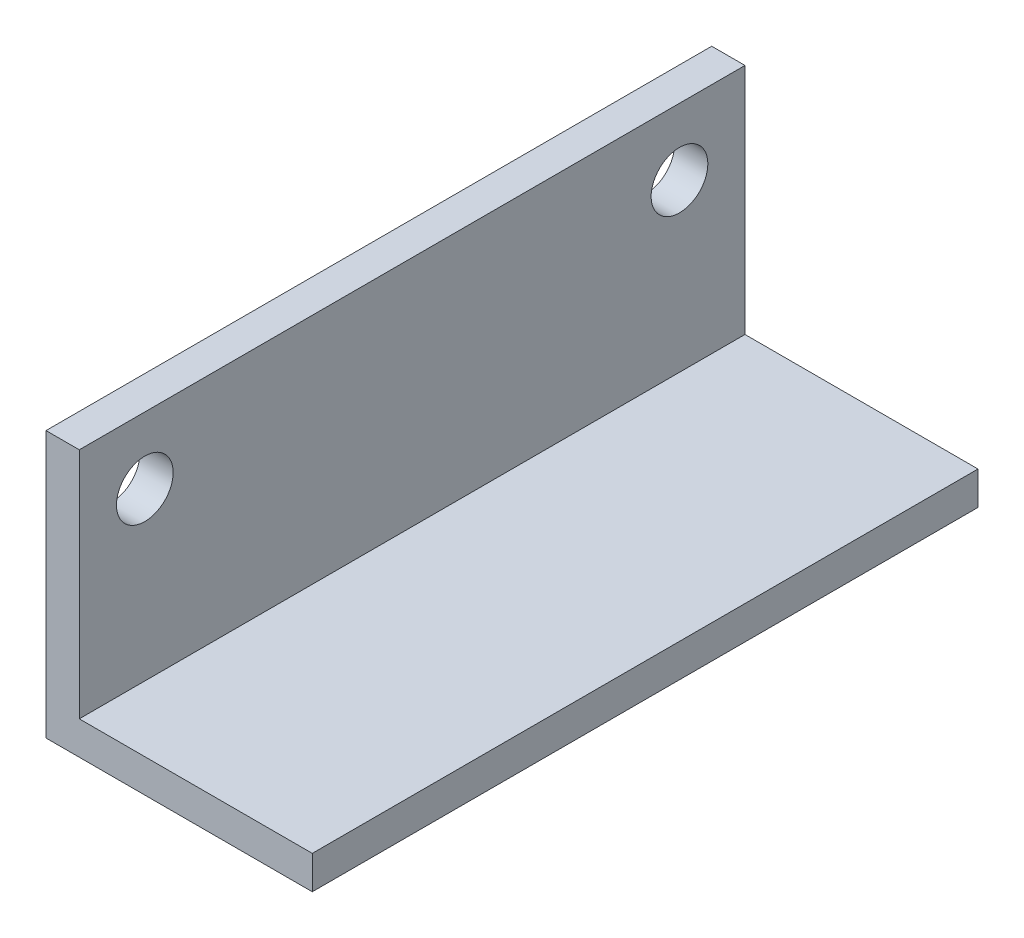
ISO-10303-21;
HEADER;
FILE_DESCRIPTION(('STEP AP214'),'2;1');
FILE_NAME('part.step','',(''),(''),'','','');
FILE_SCHEMA(('AUTOMOTIVE_DESIGN { 1 0 10303 214 1 1 1 1 }'));
ENDSEC;
DATA;
#1=APPLICATION_CONTEXT('core data for automotive mechanical design processes');
#2=APPLICATION_PROTOCOL_DEFINITION('international standard','automotive_design',2000,#1);
#3=PRODUCT_CONTEXT('',#1,'mechanical');
#4=PRODUCT('Part','Part','',(#3));
#5=PRODUCT_RELATED_PRODUCT_CATEGORY('part','',(#4));
#6=PRODUCT_DEFINITION_FORMATION('','',#4);
#7=PRODUCT_DEFINITION_CONTEXT('part definition',#1,'design');
#8=PRODUCT_DEFINITION('design','',#6,#7);
#9=PRODUCT_DEFINITION_SHAPE('','',#8);
#10=(LENGTH_UNIT() NAMED_UNIT(*) SI_UNIT(.MILLI.,.METRE.));
#11=(NAMED_UNIT(*) PLANE_ANGLE_UNIT() SI_UNIT($,.RADIAN.));
#12=(NAMED_UNIT(*) SI_UNIT($,.STERADIAN.) SOLID_ANGLE_UNIT());
#13=UNCERTAINTY_MEASURE_WITH_UNIT(LENGTH_MEASURE(1.E-05),#10,'distance_accuracy_value','');
#14=(GEOMETRIC_REPRESENTATION_CONTEXT(3) GLOBAL_UNCERTAINTY_ASSIGNED_CONTEXT((#13)) GLOBAL_UNIT_ASSIGNED_CONTEXT((#10,
#11,#12)) REPRESENTATION_CONTEXT('',''));
#15=CARTESIAN_POINT('',(0.,0.,0.));
#16=DIRECTION('',(0.,0.,1.));
#17=DIRECTION('',(1.,0.,0.));
#18=AXIS2_PLACEMENT_3D('',#15,#16,#17);
#19=CARTESIAN_POINT('',(0.,0.,63.5));
#20=DIRECTION('',(1.,0.,0.));
#21=DIRECTION('',(0.,0.,-1.));
#22=AXIS2_PLACEMENT_3D('',#19,#20,#21);
#23=PLANE('',#22);
#24=CARTESIAN_POINT('',(0.,19.05,57.25));
#25=DIRECTION('',(1.,0.,0.));
#26=DIRECTION('',(0.,0.,-1.));
#27=AXIS2_PLACEMENT_3D('',#24,#25,#26);
#28=CIRCLE('',#27,2.705);
#29=CARTESIAN_POINT('',(0.,19.05,54.545));
#30=VERTEX_POINT('',#29);
#31=EDGE_CURVE('E130',#30,#30,#28,.T.);
#32=ORIENTED_EDGE('',*,*,#31,.T.);
#33=EDGE_LOOP('',(#32));
#34=FACE_BOUND('',#33,.T.);
#35=CARTESIAN_POINT('',(0.,19.05,6.25000000000001));
#36=DIRECTION('',(1.,0.,0.));
#37=DIRECTION('',(0.,0.,-1.));
#38=AXIS2_PLACEMENT_3D('',#35,#36,#37);
#39=CIRCLE('',#38,2.705);
#40=CARTESIAN_POINT('',(0.,19.05,3.54500000000001));
#41=VERTEX_POINT('',#40);
#42=EDGE_CURVE('E174',#41,#41,#39,.T.);
#43=ORIENTED_EDGE('',*,*,#42,.T.);
#44=EDGE_LOOP('',(#43));
#45=FACE_BOUND('',#44,.T.);
#46=DIRECTION('',(0.,-1.,0.));
#47=VECTOR('',#46,1.);
#48=CARTESIAN_POINT('',(0.,0.,0.));
#49=LINE('',#48,#47);
#50=CARTESIAN_POINT('',(0.,25.4,0.));
#51=VERTEX_POINT('',#50);
#52=CARTESIAN_POINT('',(0.,0.,0.));
#53=VERTEX_POINT('',#52);
#54=EDGE_CURVE('E126',#51,#53,#49,.T.);
#55=ORIENTED_EDGE('',*,*,#54,.T.);
#56=DIRECTION('',(0.,0.,-1.));
#57=VECTOR('',#56,1.);
#58=CARTESIAN_POINT('',(0.,0.,63.5));
#59=LINE('',#58,#57);
#60=CARTESIAN_POINT('',(0.,0.,63.5));
#61=VERTEX_POINT('',#60);
#62=EDGE_CURVE('E11',#61,#53,#59,.T.);
#63=ORIENTED_EDGE('',*,*,#62,.F.);
#64=DIRECTION('',(0.,-1.,0.));
#65=VECTOR('',#64,1.);
#66=CARTESIAN_POINT('',(0.,0.,63.5));
#67=LINE('',#66,#65);
#68=CARTESIAN_POINT('',(0.,25.4,63.5));
#69=VERTEX_POINT('',#68);
#70=EDGE_CURVE('E137',#69,#61,#67,.T.);
#71=ORIENTED_EDGE('',*,*,#70,.F.);
#72=DIRECTION('',(0.,0.,-1.));
#73=VECTOR('',#72,1.);
#74=CARTESIAN_POINT('',(0.,25.4,63.5));
#75=LINE('',#74,#73);
#76=EDGE_CURVE('E122',#69,#51,#75,.T.);
#77=ORIENTED_EDGE('',*,*,#76,.T.);
#78=EDGE_LOOP('',(#55,#63,#71,#77));
#79=FACE_BOUND('',#78,.T.);
#80=ADVANCED_FACE('F42',(#34,#45,#79),#23,.F.);
#81=CARTESIAN_POINT('',(0.,0.,63.5));
#82=DIRECTION('',(0.,1.,0.));
#83=DIRECTION('',(0.,0.,1.));
#84=AXIS2_PLACEMENT_3D('',#81,#82,#83);
#85=PLANE('',#84);
#86=DIRECTION('',(1.,0.,0.));
#87=VECTOR('',#86,1.);
#88=CARTESIAN_POINT('',(0.,0.,0.));
#89=LINE('',#88,#87);
#90=CARTESIAN_POINT('',(25.4,0.,0.));
#91=VERTEX_POINT('',#90);
#92=EDGE_CURVE('E129',#53,#91,#89,.T.);
#93=ORIENTED_EDGE('',*,*,#92,.T.);
#94=DIRECTION('',(0.,0.,-1.));
#95=VECTOR('',#94,1.);
#96=CARTESIAN_POINT('',(25.4,0.,63.5));
#97=LINE('',#96,#95);
#98=CARTESIAN_POINT('',(25.4,0.,63.5));
#99=VERTEX_POINT('',#98);
#100=EDGE_CURVE('E50',#99,#91,#97,.T.);
#101=ORIENTED_EDGE('',*,*,#100,.F.);
#102=DIRECTION('',(1.,0.,0.));
#103=VECTOR('',#102,1.);
#104=CARTESIAN_POINT('',(0.,0.,63.5));
#105=LINE('',#104,#103);
#106=EDGE_CURVE('E95',#61,#99,#105,.T.);
#107=ORIENTED_EDGE('',*,*,#106,.F.);
#108=ORIENTED_EDGE('',*,*,#62,.T.);
#109=EDGE_LOOP('',(#93,#101,#107,#108));
#110=FACE_BOUND('',#109,.T.);
#111=ADVANCED_FACE('F163',(#110),#85,.F.);
#112=CARTESIAN_POINT('',(25.4,3.175,63.5));
#113=DIRECTION('',(-1.,0.,0.));
#114=DIRECTION('',(0.,0.,1.));
#115=AXIS2_PLACEMENT_3D('',#112,#113,#114);
#116=PLANE('',#115);
#117=DIRECTION('',(0.,1.,0.));
#118=VECTOR('',#117,1.);
#119=CARTESIAN_POINT('',(25.4,3.175,0.));
#120=LINE('',#119,#118);
#121=CARTESIAN_POINT('',(25.4,3.175,0.));
#122=VERTEX_POINT('',#121);
#123=EDGE_CURVE('E132',#91,#122,#120,.T.);
#124=ORIENTED_EDGE('',*,*,#123,.T.);
#125=DIRECTION('',(0.,0.,-1.));
#126=VECTOR('',#125,1.);
#127=CARTESIAN_POINT('',(25.4,3.175,63.5));
#128=LINE('',#127,#126);
#129=CARTESIAN_POINT('',(25.4,3.175,63.5));
#130=VERTEX_POINT('',#129);
#131=EDGE_CURVE('E117',#130,#122,#128,.T.);
#132=ORIENTED_EDGE('',*,*,#131,.F.);
#133=DIRECTION('',(0.,1.,0.));
#134=VECTOR('',#133,1.);
#135=CARTESIAN_POINT('',(25.4,3.175,63.5));
#136=LINE('',#135,#134);
#137=EDGE_CURVE('E108',#99,#130,#136,.T.);
#138=ORIENTED_EDGE('',*,*,#137,.F.);
#139=ORIENTED_EDGE('',*,*,#100,.T.);
#140=EDGE_LOOP('',(#124,#132,#138,#139));
#141=FACE_BOUND('',#140,.T.);
#142=ADVANCED_FACE('F143',(#141),#116,.F.);
#143=CARTESIAN_POINT('',(3.175,3.175,63.5));
#144=DIRECTION('',(0.,-1.,0.));
#145=DIRECTION('',(0.,0.,-1.));
#146=AXIS2_PLACEMENT_3D('',#143,#144,#145);
#147=PLANE('',#146);
#148=DIRECTION('',(-1.,0.,0.));
#149=VECTOR('',#148,1.);
#150=CARTESIAN_POINT('',(3.175,3.175,0.));
#151=LINE('',#150,#149);
#152=CARTESIAN_POINT('',(3.175,3.175,0.));
#153=VERTEX_POINT('',#152);
#154=EDGE_CURVE('E116',#122,#153,#151,.T.);
#155=ORIENTED_EDGE('',*,*,#154,.T.);
#156=DIRECTION('',(0.,0.,-1.));
#157=VECTOR('',#156,1.);
#158=CARTESIAN_POINT('',(3.175,3.175,63.5));
#159=LINE('',#158,#157);
#160=CARTESIAN_POINT('',(3.175,3.175,63.5));
#161=VERTEX_POINT('',#160);
#162=EDGE_CURVE('E113',#161,#153,#159,.T.);
#163=ORIENTED_EDGE('',*,*,#162,.F.);
#164=DIRECTION('',(-1.,0.,0.));
#165=VECTOR('',#164,1.);
#166=CARTESIAN_POINT('',(3.175,3.175,63.5));
#167=LINE('',#166,#165);
#168=EDGE_CURVE('E102',#130,#161,#167,.T.);
#169=ORIENTED_EDGE('',*,*,#168,.F.);
#170=ORIENTED_EDGE('',*,*,#131,.T.);
#171=EDGE_LOOP('',(#155,#163,#169,#170));
#172=FACE_BOUND('',#171,.T.);
#173=ADVANCED_FACE('F114',(#172),#147,.F.);
#174=CARTESIAN_POINT('',(3.175,3.175,63.5));
#175=DIRECTION('',(-1.,0.,0.));
#176=DIRECTION('',(0.,0.,1.));
#177=AXIS2_PLACEMENT_3D('',#174,#175,#176);
#178=PLANE('',#177);
#179=CARTESIAN_POINT('',(3.175,19.05,57.25));
#180=DIRECTION('',(1.,0.,0.));
#181=DIRECTION('',(0.,0.,-1.));
#182=AXIS2_PLACEMENT_3D('',#179,#180,#181);
#183=CIRCLE('',#182,2.705);
#184=CARTESIAN_POINT('',(3.175,19.05,54.545));
#185=VERTEX_POINT('',#184);
#186=EDGE_CURVE('E179',#185,#185,#183,.T.);
#187=ORIENTED_EDGE('',*,*,#186,.F.);
#188=EDGE_LOOP('',(#187));
#189=FACE_BOUND('',#188,.T.);
#190=CARTESIAN_POINT('',(3.175,19.05,6.25000000000001));
#191=DIRECTION('',(1.,0.,0.));
#192=DIRECTION('',(0.,0.,-1.));
#193=AXIS2_PLACEMENT_3D('',#190,#191,#192);
#194=CIRCLE('',#193,2.705);
#195=CARTESIAN_POINT('',(3.175,19.05,3.54500000000001));
#196=VERTEX_POINT('',#195);
#197=EDGE_CURVE('E176',#196,#196,#194,.T.);
#198=ORIENTED_EDGE('',*,*,#197,.F.);
#199=EDGE_LOOP('',(#198));
#200=FACE_BOUND('',#199,.T.);
#201=DIRECTION('',(0.,1.,0.));
#202=VECTOR('',#201,1.);
#203=CARTESIAN_POINT('',(3.175,3.175,0.));
#204=LINE('',#203,#202);
#205=CARTESIAN_POINT('',(3.175,25.4,0.));
#206=VERTEX_POINT('',#205);
#207=EDGE_CURVE('E81',#153,#206,#204,.T.);
#208=ORIENTED_EDGE('',*,*,#207,.T.);
#209=DIRECTION('',(0.,0.,-1.));
#210=VECTOR('',#209,1.);
#211=CARTESIAN_POINT('',(3.175,25.4,63.5));
#212=LINE('',#211,#210);
#213=CARTESIAN_POINT('',(3.175,25.4,63.5));
#214=VERTEX_POINT('',#213);
#215=EDGE_CURVE('E118',#214,#206,#212,.T.);
#216=ORIENTED_EDGE('',*,*,#215,.F.);
#217=DIRECTION('',(0.,1.,0.));
#218=VECTOR('',#217,1.);
#219=CARTESIAN_POINT('',(3.175,3.175,63.5));
#220=LINE('',#219,#218);
#221=EDGE_CURVE('E106',#161,#214,#220,.T.);
#222=ORIENTED_EDGE('',*,*,#221,.F.);
#223=ORIENTED_EDGE('',*,*,#162,.T.);
#224=EDGE_LOOP('',(#208,#216,#222,#223));
#225=FACE_BOUND('',#224,.T.);
#226=ADVANCED_FACE('F120',(#189,#200,#225),#178,.F.);
#227=CARTESIAN_POINT('',(0.,25.4,63.5));
#228=DIRECTION('',(0.,-1.,0.));
#229=DIRECTION('',(0.,0.,-1.));
#230=AXIS2_PLACEMENT_3D('',#227,#228,#229);
#231=PLANE('',#230);
#232=DIRECTION('',(-1.,0.,0.));
#233=VECTOR('',#232,1.);
#234=CARTESIAN_POINT('',(0.,25.4,0.));
#235=LINE('',#234,#233);
#236=EDGE_CURVE('E87',#206,#51,#235,.T.);
#237=ORIENTED_EDGE('',*,*,#236,.T.);
#238=ORIENTED_EDGE('',*,*,#76,.F.);
#239=DIRECTION('',(-1.,0.,0.));
#240=VECTOR('',#239,1.);
#241=CARTESIAN_POINT('',(0.,25.4,63.5));
#242=LINE('',#241,#240);
#243=EDGE_CURVE('E58',#214,#69,#242,.T.);
#244=ORIENTED_EDGE('',*,*,#243,.F.);
#245=ORIENTED_EDGE('',*,*,#215,.T.);
#246=EDGE_LOOP('',(#237,#238,#244,#245));
#247=FACE_BOUND('',#246,.T.);
#248=ADVANCED_FACE('F150',(#247),#231,.F.);
#249=CARTESIAN_POINT('',(0.,0.,63.5));
#250=DIRECTION('',(0.,0.,-1.));
#251=DIRECTION('',(-1.,0.,0.));
#252=AXIS2_PLACEMENT_3D('',#249,#250,#251);
#253=PLANE('',#252);
#254=ORIENTED_EDGE('',*,*,#70,.T.);
#255=ORIENTED_EDGE('',*,*,#106,.T.);
#256=ORIENTED_EDGE('',*,*,#137,.T.);
#257=ORIENTED_EDGE('',*,*,#168,.T.);
#258=ORIENTED_EDGE('',*,*,#221,.T.);
#259=ORIENTED_EDGE('',*,*,#243,.T.);
#260=EDGE_LOOP('',(#254,#255,#256,#257,#258,#259));
#261=FACE_BOUND('',#260,.T.);
#262=ADVANCED_FACE('F104',(#261),#253,.F.);
#263=CARTESIAN_POINT('',(0.,0.,0.));
#264=DIRECTION('',(0.,0.,-1.));
#265=DIRECTION('',(-1.,0.,0.));
#266=AXIS2_PLACEMENT_3D('',#263,#264,#265);
#267=PLANE('',#266);
#268=ORIENTED_EDGE('',*,*,#54,.F.);
#269=ORIENTED_EDGE('',*,*,#236,.F.);
#270=ORIENTED_EDGE('',*,*,#207,.F.);
#271=ORIENTED_EDGE('',*,*,#154,.F.);
#272=ORIENTED_EDGE('',*,*,#123,.F.);
#273=ORIENTED_EDGE('',*,*,#92,.F.);
#274=EDGE_LOOP('',(#268,#269,#270,#271,#272,#273));
#275=FACE_BOUND('',#274,.T.);
#276=ADVANCED_FACE('F146',(#275),#267,.T.);
#277=CARTESIAN_POINT('',(0.,19.05,6.25000000000001));
#278=DIRECTION('',(1.,0.,0.));
#279=DIRECTION('',(0.,0.,-1.));
#280=AXIS2_PLACEMENT_3D('',#277,#278,#279);
#281=CYLINDRICAL_SURFACE('',#280,2.705);
#282=ORIENTED_EDGE('',*,*,#42,.F.);
#283=EDGE_LOOP('',(#282));
#284=FACE_BOUND('',#283,.T.);
#285=ORIENTED_EDGE('',*,*,#197,.T.);
#286=EDGE_LOOP('',(#285));
#287=FACE_BOUND('',#286,.T.);
#288=ADVANCED_FACE('F192',(#284,#287),#281,.F.);
#289=CARTESIAN_POINT('',(0.,19.05,57.25));
#290=DIRECTION('',(1.,0.,0.));
#291=DIRECTION('',(0.,0.,-1.));
#292=AXIS2_PLACEMENT_3D('',#289,#290,#291);
#293=CYLINDRICAL_SURFACE('',#292,2.705);
#294=ORIENTED_EDGE('',*,*,#31,.F.);
#295=EDGE_LOOP('',(#294));
#296=FACE_BOUND('',#295,.T.);
#297=ORIENTED_EDGE('',*,*,#186,.T.);
#298=EDGE_LOOP('',(#297));
#299=FACE_BOUND('',#298,.T.);
#300=ADVANCED_FACE('F188',(#296,#299),#293,.F.);
#301=CLOSED_SHELL('',(#80,#111,#142,#173,#226,#248,#262,#276,#288,#300));
#302=MANIFOLD_SOLID_BREP('B2',#301);
#303=ADVANCED_BREP_SHAPE_REPRESENTATION('',(#18,#302),#14);
#304=SHAPE_DEFINITION_REPRESENTATION(#9,#303);
ENDSEC;
END-ISO-10303-21;
